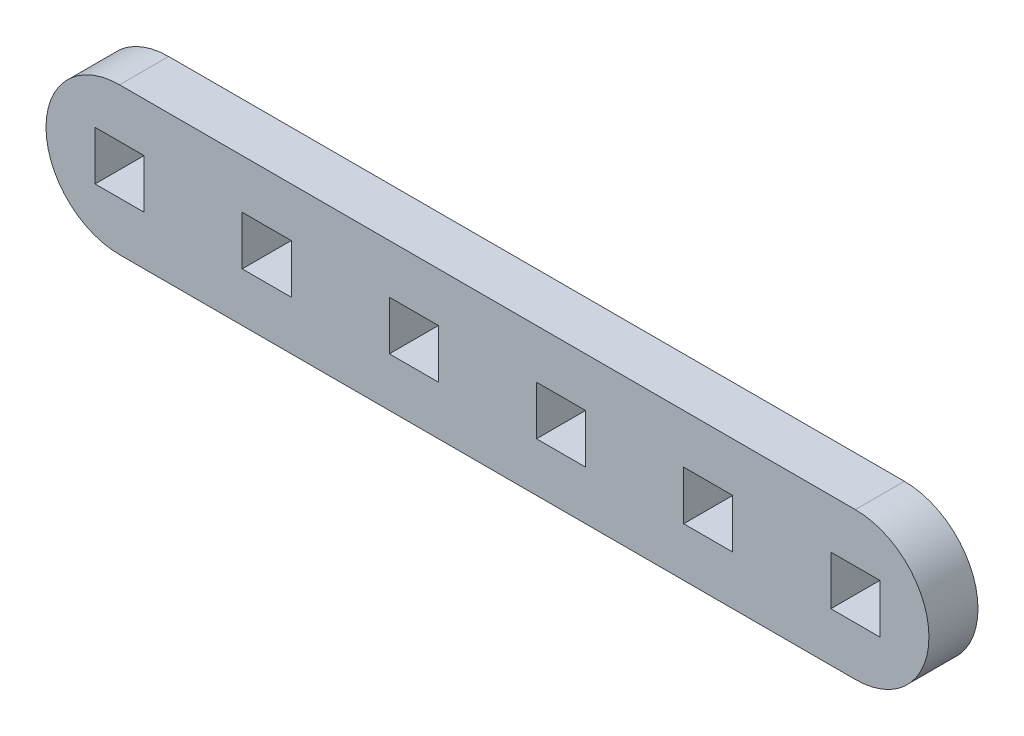
ISO-10303-21;
HEADER;
FILE_DESCRIPTION(('STEP AP214'),'2;1');
FILE_NAME('part.step','',(''),(''),'','','');
FILE_SCHEMA(('AUTOMOTIVE_DESIGN { 1 0 10303 214 1 1 1 1 }'));
ENDSEC;
DATA;
#1=APPLICATION_CONTEXT('core data for automotive mechanical design processes');
#2=APPLICATION_PROTOCOL_DEFINITION('international standard','automotive_design',2000,#1);
#3=PRODUCT_CONTEXT('',#1,'mechanical');
#4=PRODUCT('Part','Part','',(#3));
#5=PRODUCT_RELATED_PRODUCT_CATEGORY('part','',(#4));
#6=PRODUCT_DEFINITION_FORMATION('','',#4);
#7=PRODUCT_DEFINITION_CONTEXT('part definition',#1,'design');
#8=PRODUCT_DEFINITION('design','',#6,#7);
#9=PRODUCT_DEFINITION_SHAPE('','',#8);
#10=(LENGTH_UNIT() NAMED_UNIT(*) SI_UNIT(.MILLI.,.METRE.));
#11=(NAMED_UNIT(*) PLANE_ANGLE_UNIT() SI_UNIT($,.RADIAN.));
#12=(NAMED_UNIT(*) SI_UNIT($,.STERADIAN.) SOLID_ANGLE_UNIT());
#13=UNCERTAINTY_MEASURE_WITH_UNIT(LENGTH_MEASURE(1.E-05),#10,'distance_accuracy_value','');
#14=(GEOMETRIC_REPRESENTATION_CONTEXT(3) GLOBAL_UNCERTAINTY_ASSIGNED_CONTEXT((#13)) GLOBAL_UNIT_ASSIGNED_CONTEXT((#10,
#11,#12)) REPRESENTATION_CONTEXT('',''));
#15=CARTESIAN_POINT('',(0.,0.,0.));
#16=DIRECTION('',(0.,0.,1.));
#17=DIRECTION('',(1.,0.,0.));
#18=AXIS2_PLACEMENT_3D('',#15,#16,#17);
#19=CARTESIAN_POINT('',(12.1812224812,293.6364750946,3.));
#20=DIRECTION('',(0.,0.,1.));
#21=DIRECTION('',(1.,0.,0.));
#22=AXIS2_PLACEMENT_3D('',#19,#20,#21);
#23=PLANE('',#22);
#24=DIRECTION('',(0.,-1.,0.));
#25=VECTOR('',#24,1.);
#26=CARTESIAN_POINT('',(55.6812224812,295.1364750946,3.));
#27=LINE('',#26,#25);
#28=CARTESIAN_POINT('',(55.6812224812,295.1364750946,3.));
#29=VERTEX_POINT('',#28);
#30=CARTESIAN_POINT('',(55.6812224812,292.1364750946,3.));
#31=VERTEX_POINT('',#30);
#32=EDGE_CURVE('E256',#29,#31,#27,.T.);
#33=ORIENTED_EDGE('',*,*,#32,.F.);
#34=DIRECTION('',(-1.,0.,0.));
#35=VECTOR('',#34,1.);
#36=CARTESIAN_POINT('',(58.6812224812,295.1364750946,3.));
#37=LINE('',#36,#35);
#38=CARTESIAN_POINT('',(58.6812224812,295.1364750946,3.));
#39=VERTEX_POINT('',#38);
#40=EDGE_CURVE('E254',#39,#29,#37,.T.);
#41=ORIENTED_EDGE('',*,*,#40,.F.);
#42=DIRECTION('',(0.,1.,0.));
#43=VECTOR('',#42,1.);
#44=CARTESIAN_POINT('',(58.6812224812,292.1364750946,3.));
#45=LINE('',#44,#43);
#46=CARTESIAN_POINT('',(58.6812224812,292.1364750946,3.));
#47=VERTEX_POINT('',#46);
#48=EDGE_CURVE('E262',#47,#39,#45,.T.);
#49=ORIENTED_EDGE('',*,*,#48,.F.);
#50=DIRECTION('',(1.,0.,0.));
#51=VECTOR('',#50,1.);
#52=CARTESIAN_POINT('',(55.6812224812,292.1364750946,3.));
#53=LINE('',#52,#51);
#54=EDGE_CURVE('E259',#31,#47,#53,.T.);
#55=ORIENTED_EDGE('',*,*,#54,.F.);
#56=EDGE_LOOP('',(#33,#41,#49,#55));
#57=FACE_BOUND('',#56,.T.);
#58=DIRECTION('',(0.,-1.,0.));
#59=VECTOR('',#58,1.);
#60=CARTESIAN_POINT('',(28.6812224812,295.1364750946,3.));
#61=LINE('',#60,#59);
#62=CARTESIAN_POINT('',(28.6812224812,295.1364750946,3.));
#63=VERTEX_POINT('',#62);
#64=CARTESIAN_POINT('',(28.6812224812,292.1364750946,3.));
#65=VERTEX_POINT('',#64);
#66=EDGE_CURVE('E318',#63,#65,#61,.T.);
#67=ORIENTED_EDGE('',*,*,#66,.F.);
#68=DIRECTION('',(-1.,0.,0.));
#69=VECTOR('',#68,1.);
#70=CARTESIAN_POINT('',(31.6812224812,295.1364750946,3.));
#71=LINE('',#70,#69);
#72=CARTESIAN_POINT('',(31.6812224812,295.1364750946,3.));
#73=VERTEX_POINT('',#72);
#74=EDGE_CURVE('E316',#73,#63,#71,.T.);
#75=ORIENTED_EDGE('',*,*,#74,.F.);
#76=DIRECTION('',(0.,1.,0.));
#77=VECTOR('',#76,1.);
#78=CARTESIAN_POINT('',(31.6812224812,292.1364750946,3.));
#79=LINE('',#78,#77);
#80=CARTESIAN_POINT('',(31.6812224812,292.1364750946,3.));
#81=VERTEX_POINT('',#80);
#82=EDGE_CURVE('E324',#81,#73,#79,.T.);
#83=ORIENTED_EDGE('',*,*,#82,.F.);
#84=DIRECTION('',(1.,0.,0.));
#85=VECTOR('',#84,1.);
#86=CARTESIAN_POINT('',(28.6812224812,292.1364750946,3.));
#87=LINE('',#86,#85);
#88=EDGE_CURVE('E321',#65,#81,#87,.T.);
#89=ORIENTED_EDGE('',*,*,#88,.F.);
#90=EDGE_LOOP('',(#67,#75,#83,#89));
#91=FACE_BOUND('',#90,.T.);
#92=DIRECTION('',(0.,-1.,0.));
#93=VECTOR('',#92,1.);
#94=CARTESIAN_POINT('',(10.6812224812,295.1364750946,3.));
#95=LINE('',#94,#93);
#96=CARTESIAN_POINT('',(10.6812224812,295.1364750946,3.));
#97=VERTEX_POINT('',#96);
#98=CARTESIAN_POINT('',(10.6812224812,292.1364750946,3.));
#99=VERTEX_POINT('',#98);
#100=EDGE_CURVE('E380',#97,#99,#95,.T.);
#101=ORIENTED_EDGE('',*,*,#100,.F.);
#102=DIRECTION('',(-1.,0.,0.));
#103=VECTOR('',#102,1.);
#104=CARTESIAN_POINT('',(13.6812224812,295.1364750946,3.));
#105=LINE('',#104,#103);
#106=CARTESIAN_POINT('',(13.6812224812,295.1364750946,3.));
#107=VERTEX_POINT('',#106);
#108=EDGE_CURVE('E378',#107,#97,#105,.T.);
#109=ORIENTED_EDGE('',*,*,#108,.F.);
#110=DIRECTION('',(0.,1.,0.));
#111=VECTOR('',#110,1.);
#112=CARTESIAN_POINT('',(13.6812224812,292.1364750946,3.));
#113=LINE('',#112,#111);
#114=CARTESIAN_POINT('',(13.6812224812,292.1364750946,3.));
#115=VERTEX_POINT('',#114);
#116=EDGE_CURVE('E386',#115,#107,#113,.T.);
#117=ORIENTED_EDGE('',*,*,#116,.F.);
#118=DIRECTION('',(1.,0.,0.));
#119=VECTOR('',#118,1.);
#120=CARTESIAN_POINT('',(10.6812224812,292.1364750946,3.));
#121=LINE('',#120,#119);
#122=EDGE_CURVE('E383',#99,#115,#121,.T.);
#123=ORIENTED_EDGE('',*,*,#122,.F.);
#124=EDGE_LOOP('',(#101,#109,#117,#123));
#125=FACE_BOUND('',#124,.T.);
#126=CARTESIAN_POINT('',(12.1812224812,293.6364750946,3.));
#127=DIRECTION('',(0.,0.,1.));
#128=DIRECTION('',(1.,0.,0.));
#129=AXIS2_PLACEMENT_3D('',#126,#127,#128);
#130=CIRCLE('',#129,4.5);
#131=CARTESIAN_POINT('',(12.1812224812,298.1364750946,3.));
#132=VERTEX_POINT('',#131);
#133=CARTESIAN_POINT('',(12.1812224812,289.1364750946,3.));
#134=VERTEX_POINT('',#133);
#135=EDGE_CURVE('E409',#132,#134,#130,.T.);
#136=ORIENTED_EDGE('',*,*,#135,.T.);
#137=DIRECTION('',(1.,0.,0.));
#138=VECTOR('',#137,1.);
#139=CARTESIAN_POINT('',(12.1812224812,289.1364750946,3.));
#140=LINE('',#139,#138);
#141=CARTESIAN_POINT('',(57.1812224812,289.1364750946,3.));
#142=VERTEX_POINT('',#141);
#143=EDGE_CURVE('E412',#134,#142,#140,.T.);
#144=ORIENTED_EDGE('',*,*,#143,.T.);
#145=CARTESIAN_POINT('',(57.1812224812,293.6364750946,3.));
#146=DIRECTION('',(0.,0.,1.));
#147=DIRECTION('',(1.,0.,0.));
#148=AXIS2_PLACEMENT_3D('',#145,#146,#147);
#149=CIRCLE('',#148,4.5);
#150=CARTESIAN_POINT('',(57.1812224812,298.1364750946,3.));
#151=VERTEX_POINT('',#150);
#152=EDGE_CURVE('E415',#142,#151,#149,.T.);
#153=ORIENTED_EDGE('',*,*,#152,.T.);
#154=DIRECTION('',(-1.,0.,0.));
#155=VECTOR('',#154,1.);
#156=CARTESIAN_POINT('',(12.1812224812,298.1364750946,3.));
#157=LINE('',#156,#155);
#158=EDGE_CURVE('E417',#151,#132,#157,.T.);
#159=ORIENTED_EDGE('',*,*,#158,.T.);
#160=EDGE_LOOP('',(#136,#144,#153,#159));
#161=FACE_BOUND('',#160,.T.);
#162=DIRECTION('',(0.,-1.,0.));
#163=VECTOR('',#162,1.);
#164=CARTESIAN_POINT('',(19.6812224812,295.1364750946,3.));
#165=LINE('',#164,#163);
#166=CARTESIAN_POINT('',(19.6812224812,295.1364750946,3.));
#167=VERTEX_POINT('',#166);
#168=CARTESIAN_POINT('',(19.6812224812,292.1364750946,3.));
#169=VERTEX_POINT('',#168);
#170=EDGE_CURVE('E349',#167,#169,#165,.T.);
#171=ORIENTED_EDGE('',*,*,#170,.F.);
#172=DIRECTION('',(-1.,0.,0.));
#173=VECTOR('',#172,1.);
#174=CARTESIAN_POINT('',(22.6812224812,295.1364750946,3.));
#175=LINE('',#174,#173);
#176=CARTESIAN_POINT('',(22.6812224812,295.1364750946,3.));
#177=VERTEX_POINT('',#176);
#178=EDGE_CURVE('E347',#177,#167,#175,.T.);
#179=ORIENTED_EDGE('',*,*,#178,.F.);
#180=DIRECTION('',(0.,1.,0.));
#181=VECTOR('',#180,1.);
#182=CARTESIAN_POINT('',(22.6812224812,292.1364750946,3.));
#183=LINE('',#182,#181);
#184=CARTESIAN_POINT('',(22.6812224812,292.1364750946,3.));
#185=VERTEX_POINT('',#184);
#186=EDGE_CURVE('E355',#185,#177,#183,.T.);
#187=ORIENTED_EDGE('',*,*,#186,.F.);
#188=DIRECTION('',(1.,0.,0.));
#189=VECTOR('',#188,1.);
#190=CARTESIAN_POINT('',(19.6812224812,292.1364750946,3.));
#191=LINE('',#190,#189);
#192=EDGE_CURVE('E352',#169,#185,#191,.T.);
#193=ORIENTED_EDGE('',*,*,#192,.F.);
#194=EDGE_LOOP('',(#171,#179,#187,#193));
#195=FACE_BOUND('',#194,.T.);
#196=DIRECTION('',(0.,-1.,0.));
#197=VECTOR('',#196,1.);
#198=CARTESIAN_POINT('',(37.6812224812,295.1364750946,3.));
#199=LINE('',#198,#197);
#200=CARTESIAN_POINT('',(37.6812224812,295.1364750946,3.));
#201=VERTEX_POINT('',#200);
#202=CARTESIAN_POINT('',(37.6812224812,292.1364750946,3.));
#203=VERTEX_POINT('',#202);
#204=EDGE_CURVE('E287',#201,#203,#199,.T.);
#205=ORIENTED_EDGE('',*,*,#204,.F.);
#206=DIRECTION('',(-1.,0.,0.));
#207=VECTOR('',#206,1.);
#208=CARTESIAN_POINT('',(40.6812224812,295.1364750946,3.));
#209=LINE('',#208,#207);
#210=CARTESIAN_POINT('',(40.6812224812,295.1364750946,3.));
#211=VERTEX_POINT('',#210);
#212=EDGE_CURVE('E285',#211,#201,#209,.T.);
#213=ORIENTED_EDGE('',*,*,#212,.F.);
#214=DIRECTION('',(0.,1.,0.));
#215=VECTOR('',#214,1.);
#216=CARTESIAN_POINT('',(40.6812224812,292.1364750946,3.));
#217=LINE('',#216,#215);
#218=CARTESIAN_POINT('',(40.6812224812,292.1364750946,3.));
#219=VERTEX_POINT('',#218);
#220=EDGE_CURVE('E293',#219,#211,#217,.T.);
#221=ORIENTED_EDGE('',*,*,#220,.F.);
#222=DIRECTION('',(1.,0.,0.));
#223=VECTOR('',#222,1.);
#224=CARTESIAN_POINT('',(37.6812224812,292.1364750946,3.));
#225=LINE('',#224,#223);
#226=EDGE_CURVE('E290',#203,#219,#225,.T.);
#227=ORIENTED_EDGE('',*,*,#226,.F.);
#228=EDGE_LOOP('',(#205,#213,#221,#227));
#229=FACE_BOUND('',#228,.T.);
#230=DIRECTION('',(0.,-1.,0.));
#231=VECTOR('',#230,1.);
#232=CARTESIAN_POINT('',(46.6812224812,295.1364750946,3.));
#233=LINE('',#232,#231);
#234=CARTESIAN_POINT('',(46.6812224812,295.1364750946,3.));
#235=VERTEX_POINT('',#234);
#236=CARTESIAN_POINT('',(46.6812224812,292.1364750946,3.));
#237=VERTEX_POINT('',#236);
#238=EDGE_CURVE('E226',#235,#237,#233,.T.);
#239=ORIENTED_EDGE('',*,*,#238,.F.);
#240=DIRECTION('',(-1.,0.,0.));
#241=VECTOR('',#240,1.);
#242=CARTESIAN_POINT('',(49.6812224812,295.1364750946,3.));
#243=LINE('',#242,#241);
#244=CARTESIAN_POINT('',(49.6812224812,295.1364750946,3.));
#245=VERTEX_POINT('',#244);
#246=EDGE_CURVE('E218',#245,#235,#243,.T.);
#247=ORIENTED_EDGE('',*,*,#246,.F.);
#248=DIRECTION('',(0.,1.,0.));
#249=VECTOR('',#248,1.);
#250=CARTESIAN_POINT('',(49.6812224812,292.1364750946,3.));
#251=LINE('',#250,#249);
#252=CARTESIAN_POINT('',(49.6812224812,292.1364750946,3.));
#253=VERTEX_POINT('',#252);
#254=EDGE_CURVE('E240',#253,#245,#251,.T.);
#255=ORIENTED_EDGE('',*,*,#254,.F.);
#256=DIRECTION('',(1.,0.,0.));
#257=VECTOR('',#256,1.);
#258=CARTESIAN_POINT('',(46.6812224812,292.1364750946,3.));
#259=LINE('',#258,#257);
#260=EDGE_CURVE('E238',#237,#253,#259,.T.);
#261=ORIENTED_EDGE('',*,*,#260,.F.);
#262=EDGE_LOOP('',(#239,#247,#255,#261));
#263=FACE_BOUND('',#262,.T.);
#264=ADVANCED_FACE('F33',(#57,#91,#125,#161,#195,#229,#263),#23,.T.);
#265=CARTESIAN_POINT('',(12.1812224812,293.6364750946,0.));
#266=DIRECTION('',(0.,0.,1.));
#267=DIRECTION('',(1.,0.,0.));
#268=AXIS2_PLACEMENT_3D('',#265,#266,#267);
#269=PLANE('',#268);
#270=DIRECTION('',(-1.,0.,0.));
#271=VECTOR('',#270,1.);
#272=CARTESIAN_POINT('',(58.6812224812,295.1364750946,0.));
#273=LINE('',#272,#271);
#274=CARTESIAN_POINT('',(58.6812224812,295.1364750946,0.));
#275=VERTEX_POINT('',#274);
#276=CARTESIAN_POINT('',(55.6812224812,295.1364750946,0.));
#277=VERTEX_POINT('',#276);
#278=EDGE_CURVE('E234',#275,#277,#273,.T.);
#279=ORIENTED_EDGE('',*,*,#278,.T.);
#280=DIRECTION('',(0.,-1.,0.));
#281=VECTOR('',#280,1.);
#282=CARTESIAN_POINT('',(55.6812224812,295.1364750946,0.));
#283=LINE('',#282,#281);
#284=CARTESIAN_POINT('',(55.6812224812,292.1364750946,0.));
#285=VERTEX_POINT('',#284);
#286=EDGE_CURVE('E267',#277,#285,#283,.T.);
#287=ORIENTED_EDGE('',*,*,#286,.T.);
#288=DIRECTION('',(1.,0.,0.));
#289=VECTOR('',#288,1.);
#290=CARTESIAN_POINT('',(55.6812224812,292.1364750946,0.));
#291=LINE('',#290,#289);
#292=CARTESIAN_POINT('',(58.6812224812,292.1364750946,0.));
#293=VERTEX_POINT('',#292);
#294=EDGE_CURVE('E270',#285,#293,#291,.T.);
#295=ORIENTED_EDGE('',*,*,#294,.T.);
#296=DIRECTION('',(0.,1.,0.));
#297=VECTOR('',#296,1.);
#298=CARTESIAN_POINT('',(58.6812224812,292.1364750946,0.));
#299=LINE('',#298,#297);
#300=EDGE_CURVE('E257',#293,#275,#299,.T.);
#301=ORIENTED_EDGE('',*,*,#300,.T.);
#302=EDGE_LOOP('',(#279,#287,#295,#301));
#303=FACE_BOUND('',#302,.T.);
#304=DIRECTION('',(-1.,0.,0.));
#305=VECTOR('',#304,1.);
#306=CARTESIAN_POINT('',(31.6812224812,295.1364750946,0.));
#307=LINE('',#306,#305);
#308=CARTESIAN_POINT('',(31.6812224812,295.1364750946,0.));
#309=VERTEX_POINT('',#308);
#310=CARTESIAN_POINT('',(28.6812224812,295.1364750946,0.));
#311=VERTEX_POINT('',#310);
#312=EDGE_CURVE('E315',#309,#311,#307,.T.);
#313=ORIENTED_EDGE('',*,*,#312,.T.);
#314=DIRECTION('',(0.,-1.,0.));
#315=VECTOR('',#314,1.);
#316=CARTESIAN_POINT('',(28.6812224812,295.1364750946,0.));
#317=LINE('',#316,#315);
#318=CARTESIAN_POINT('',(28.6812224812,292.1364750946,0.));
#319=VERTEX_POINT('',#318);
#320=EDGE_CURVE('E329',#311,#319,#317,.T.);
#321=ORIENTED_EDGE('',*,*,#320,.T.);
#322=DIRECTION('',(1.,0.,0.));
#323=VECTOR('',#322,1.);
#324=CARTESIAN_POINT('',(28.6812224812,292.1364750946,0.));
#325=LINE('',#324,#323);
#326=CARTESIAN_POINT('',(31.6812224812,292.1364750946,0.));
#327=VERTEX_POINT('',#326);
#328=EDGE_CURVE('E332',#319,#327,#325,.T.);
#329=ORIENTED_EDGE('',*,*,#328,.T.);
#330=DIRECTION('',(0.,1.,0.));
#331=VECTOR('',#330,1.);
#332=CARTESIAN_POINT('',(31.6812224812,292.1364750946,0.));
#333=LINE('',#332,#331);
#334=EDGE_CURVE('E319',#327,#309,#333,.T.);
#335=ORIENTED_EDGE('',*,*,#334,.T.);
#336=EDGE_LOOP('',(#313,#321,#329,#335));
#337=FACE_BOUND('',#336,.T.);
#338=DIRECTION('',(-1.,0.,0.));
#339=VECTOR('',#338,1.);
#340=CARTESIAN_POINT('',(13.6812224812,295.1364750946,0.));
#341=LINE('',#340,#339);
#342=CARTESIAN_POINT('',(13.6812224812,295.1364750946,0.));
#343=VERTEX_POINT('',#342);
#344=CARTESIAN_POINT('',(10.6812224812,295.1364750946,0.));
#345=VERTEX_POINT('',#344);
#346=EDGE_CURVE('E377',#343,#345,#341,.T.);
#347=ORIENTED_EDGE('',*,*,#346,.T.);
#348=DIRECTION('',(0.,-1.,0.));
#349=VECTOR('',#348,1.);
#350=CARTESIAN_POINT('',(10.6812224812,295.1364750946,0.));
#351=LINE('',#350,#349);
#352=CARTESIAN_POINT('',(10.6812224812,292.1364750946,0.));
#353=VERTEX_POINT('',#352);
#354=EDGE_CURVE('E391',#345,#353,#351,.T.);
#355=ORIENTED_EDGE('',*,*,#354,.T.);
#356=DIRECTION('',(1.,0.,0.));
#357=VECTOR('',#356,1.);
#358=CARTESIAN_POINT('',(10.6812224812,292.1364750946,0.));
#359=LINE('',#358,#357);
#360=CARTESIAN_POINT('',(13.6812224812,292.1364750946,0.));
#361=VERTEX_POINT('',#360);
#362=EDGE_CURVE('E394',#353,#361,#359,.T.);
#363=ORIENTED_EDGE('',*,*,#362,.T.);
#364=DIRECTION('',(0.,1.,0.));
#365=VECTOR('',#364,1.);
#366=CARTESIAN_POINT('',(13.6812224812,292.1364750946,0.));
#367=LINE('',#366,#365);
#368=EDGE_CURVE('E381',#361,#343,#367,.T.);
#369=ORIENTED_EDGE('',*,*,#368,.T.);
#370=EDGE_LOOP('',(#347,#355,#363,#369));
#371=FACE_BOUND('',#370,.T.);
#372=CARTESIAN_POINT('',(12.1812224812,293.6364750946,0.));
#373=DIRECTION('',(0.,0.,1.));
#374=DIRECTION('',(1.,0.,0.));
#375=AXIS2_PLACEMENT_3D('',#372,#373,#374);
#376=CIRCLE('',#375,4.5);
#377=CARTESIAN_POINT('',(12.1812224812,298.1364750946,0.));
#378=VERTEX_POINT('',#377);
#379=CARTESIAN_POINT('',(12.1812224812,289.1364750946,0.));
#380=VERTEX_POINT('',#379);
#381=EDGE_CURVE('E408',#378,#380,#376,.T.);
#382=ORIENTED_EDGE('',*,*,#381,.F.);
#383=DIRECTION('',(-1.,0.,0.));
#384=VECTOR('',#383,1.);
#385=CARTESIAN_POINT('',(12.1812224812,298.1364750946,0.));
#386=LINE('',#385,#384);
#387=CARTESIAN_POINT('',(57.1812224812,298.1364750946,0.));
#388=VERTEX_POINT('',#387);
#389=EDGE_CURVE('E413',#388,#378,#386,.T.);
#390=ORIENTED_EDGE('',*,*,#389,.F.);
#391=CARTESIAN_POINT('',(57.1812224812,293.6364750946,0.));
#392=DIRECTION('',(0.,0.,1.));
#393=DIRECTION('',(1.,0.,0.));
#394=AXIS2_PLACEMENT_3D('',#391,#392,#393);
#395=CIRCLE('',#394,4.5);
#396=CARTESIAN_POINT('',(57.1812224812,289.1364750946,0.));
#397=VERTEX_POINT('',#396);
#398=EDGE_CURVE('E424',#397,#388,#395,.T.);
#399=ORIENTED_EDGE('',*,*,#398,.F.);
#400=DIRECTION('',(1.,0.,0.));
#401=VECTOR('',#400,1.);
#402=CARTESIAN_POINT('',(12.1812224812,289.1364750946,0.));
#403=LINE('',#402,#401);
#404=EDGE_CURVE('E422',#380,#397,#403,.T.);
#405=ORIENTED_EDGE('',*,*,#404,.F.);
#406=EDGE_LOOP('',(#382,#390,#399,#405));
#407=FACE_BOUND('',#406,.T.);
#408=DIRECTION('',(-1.,0.,0.));
#409=VECTOR('',#408,1.);
#410=CARTESIAN_POINT('',(22.6812224812,295.1364750946,0.));
#411=LINE('',#410,#409);
#412=CARTESIAN_POINT('',(22.6812224812,295.1364750946,0.));
#413=VERTEX_POINT('',#412);
#414=CARTESIAN_POINT('',(19.6812224812,295.1364750946,0.));
#415=VERTEX_POINT('',#414);
#416=EDGE_CURVE('E346',#413,#415,#411,.T.);
#417=ORIENTED_EDGE('',*,*,#416,.T.);
#418=DIRECTION('',(0.,-1.,0.));
#419=VECTOR('',#418,1.);
#420=CARTESIAN_POINT('',(19.6812224812,295.1364750946,0.));
#421=LINE('',#420,#419);
#422=CARTESIAN_POINT('',(19.6812224812,292.1364750946,0.));
#423=VERTEX_POINT('',#422);
#424=EDGE_CURVE('E360',#415,#423,#421,.T.);
#425=ORIENTED_EDGE('',*,*,#424,.T.);
#426=DIRECTION('',(1.,0.,0.));
#427=VECTOR('',#426,1.);
#428=CARTESIAN_POINT('',(19.6812224812,292.1364750946,0.));
#429=LINE('',#428,#427);
#430=CARTESIAN_POINT('',(22.6812224812,292.1364750946,0.));
#431=VERTEX_POINT('',#430);
#432=EDGE_CURVE('E363',#423,#431,#429,.T.);
#433=ORIENTED_EDGE('',*,*,#432,.T.);
#434=DIRECTION('',(0.,1.,0.));
#435=VECTOR('',#434,1.);
#436=CARTESIAN_POINT('',(22.6812224812,292.1364750946,0.));
#437=LINE('',#436,#435);
#438=EDGE_CURVE('E350',#431,#413,#437,.T.);
#439=ORIENTED_EDGE('',*,*,#438,.T.);
#440=EDGE_LOOP('',(#417,#425,#433,#439));
#441=FACE_BOUND('',#440,.T.);
#442=DIRECTION('',(-1.,0.,0.));
#443=VECTOR('',#442,1.);
#444=CARTESIAN_POINT('',(40.6812224812,295.1364750946,0.));
#445=LINE('',#444,#443);
#446=CARTESIAN_POINT('',(40.6812224812,295.1364750946,0.));
#447=VERTEX_POINT('',#446);
#448=CARTESIAN_POINT('',(37.6812224812,295.1364750946,0.));
#449=VERTEX_POINT('',#448);
#450=EDGE_CURVE('E284',#447,#449,#445,.T.);
#451=ORIENTED_EDGE('',*,*,#450,.T.);
#452=DIRECTION('',(0.,-1.,0.));
#453=VECTOR('',#452,1.);
#454=CARTESIAN_POINT('',(37.6812224812,295.1364750946,0.));
#455=LINE('',#454,#453);
#456=CARTESIAN_POINT('',(37.6812224812,292.1364750946,0.));
#457=VERTEX_POINT('',#456);
#458=EDGE_CURVE('E298',#449,#457,#455,.T.);
#459=ORIENTED_EDGE('',*,*,#458,.T.);
#460=DIRECTION('',(1.,0.,0.));
#461=VECTOR('',#460,1.);
#462=CARTESIAN_POINT('',(37.6812224812,292.1364750946,0.));
#463=LINE('',#462,#461);
#464=CARTESIAN_POINT('',(40.6812224812,292.1364750946,0.));
#465=VERTEX_POINT('',#464);
#466=EDGE_CURVE('E301',#457,#465,#463,.T.);
#467=ORIENTED_EDGE('',*,*,#466,.T.);
#468=DIRECTION('',(0.,1.,0.));
#469=VECTOR('',#468,1.);
#470=CARTESIAN_POINT('',(40.6812224812,292.1364750946,0.));
#471=LINE('',#470,#469);
#472=EDGE_CURVE('E288',#465,#447,#471,.T.);
#473=ORIENTED_EDGE('',*,*,#472,.T.);
#474=EDGE_LOOP('',(#451,#459,#467,#473));
#475=FACE_BOUND('',#474,.T.);
#476=DIRECTION('',(-1.,0.,0.));
#477=VECTOR('',#476,1.);
#478=CARTESIAN_POINT('',(49.6812224812,295.1364750946,0.));
#479=LINE('',#478,#477);
#480=CARTESIAN_POINT('',(49.6812224812,295.1364750946,0.));
#481=VERTEX_POINT('',#480);
#482=CARTESIAN_POINT('',(46.6812224812,295.1364750946,0.));
#483=VERTEX_POINT('',#482);
#484=EDGE_CURVE('E56',#481,#483,#479,.T.);
#485=ORIENTED_EDGE('',*,*,#484,.T.);
#486=DIRECTION('',(0.,-1.,0.));
#487=VECTOR('',#486,1.);
#488=CARTESIAN_POINT('',(46.6812224812,295.1364750946,0.));
#489=LINE('',#488,#487);
#490=CARTESIAN_POINT('',(46.6812224812,292.1364750946,0.));
#491=VERTEX_POINT('',#490);
#492=EDGE_CURVE('E233',#483,#491,#489,.T.);
#493=ORIENTED_EDGE('',*,*,#492,.T.);
#494=DIRECTION('',(1.,0.,0.));
#495=VECTOR('',#494,1.);
#496=CARTESIAN_POINT('',(46.6812224812,292.1364750946,0.));
#497=LINE('',#496,#495);
#498=CARTESIAN_POINT('',(49.6812224812,292.1364750946,0.));
#499=VERTEX_POINT('',#498);
#500=EDGE_CURVE('E246',#491,#499,#497,.T.);
#501=ORIENTED_EDGE('',*,*,#500,.T.);
#502=DIRECTION('',(0.,1.,0.));
#503=VECTOR('',#502,1.);
#504=CARTESIAN_POINT('',(49.6812224812,292.1364750946,0.));
#505=LINE('',#504,#503);
#506=EDGE_CURVE('E227',#499,#481,#505,.T.);
#507=ORIENTED_EDGE('',*,*,#506,.T.);
#508=EDGE_LOOP('',(#485,#493,#501,#507));
#509=FACE_BOUND('',#508,.T.);
#510=ADVANCED_FACE('F442',(#303,#337,#371,#407,#441,#475,#509),#269,.F.);
#511=CARTESIAN_POINT('',(12.1812224812,293.6364750946,3.));
#512=DIRECTION('',(0.,0.,-1.));
#513=DIRECTION('',(-1.,0.,0.));
#514=AXIS2_PLACEMENT_3D('',#511,#512,#513);
#515=CYLINDRICAL_SURFACE('',#514,4.5);
#516=ORIENTED_EDGE('',*,*,#381,.T.);
#517=DIRECTION('',(0.,0.,-1.));
#518=VECTOR('',#517,1.);
#519=CARTESIAN_POINT('',(12.1812224812,289.1364750946,3.));
#520=LINE('',#519,#518);
#521=EDGE_CURVE('E11',#134,#380,#520,.T.);
#522=ORIENTED_EDGE('',*,*,#521,.F.);
#523=ORIENTED_EDGE('',*,*,#135,.F.);
#524=DIRECTION('',(0.,0.,-1.));
#525=VECTOR('',#524,1.);
#526=CARTESIAN_POINT('',(12.1812224812,298.1364750946,3.));
#527=LINE('',#526,#525);
#528=EDGE_CURVE('E419',#132,#378,#527,.T.);
#529=ORIENTED_EDGE('',*,*,#528,.T.);
#530=EDGE_LOOP('',(#516,#522,#523,#529));
#531=FACE_BOUND('',#530,.T.);
#532=ADVANCED_FACE('F35',(#531),#515,.T.);
#533=CARTESIAN_POINT('',(12.1812224812,289.1364750946,3.));
#534=DIRECTION('',(0.,1.,0.));
#535=DIRECTION('',(0.,0.,1.));
#536=AXIS2_PLACEMENT_3D('',#533,#534,#535);
#537=PLANE('',#536);
#538=ORIENTED_EDGE('',*,*,#404,.T.);
#539=DIRECTION('',(0.,0.,-1.));
#540=VECTOR('',#539,1.);
#541=CARTESIAN_POINT('',(57.1812224812,289.1364750946,3.));
#542=LINE('',#541,#540);
#543=EDGE_CURVE('E41',#142,#397,#542,.T.);
#544=ORIENTED_EDGE('',*,*,#543,.F.);
#545=ORIENTED_EDGE('',*,*,#143,.F.);
#546=ORIENTED_EDGE('',*,*,#521,.T.);
#547=EDGE_LOOP('',(#538,#544,#545,#546));
#548=FACE_BOUND('',#547,.T.);
#549=ADVANCED_FACE('F453',(#548),#537,.F.);
#550=CARTESIAN_POINT('',(57.1812224812,293.6364750946,3.));
#551=DIRECTION('',(0.,0.,-1.));
#552=DIRECTION('',(-1.,0.,0.));
#553=AXIS2_PLACEMENT_3D('',#550,#551,#552);
#554=CYLINDRICAL_SURFACE('',#553,4.5);
#555=ORIENTED_EDGE('',*,*,#398,.T.);
#556=DIRECTION('',(0.,0.,-1.));
#557=VECTOR('',#556,1.);
#558=CARTESIAN_POINT('',(57.1812224812,298.1364750946,3.));
#559=LINE('',#558,#557);
#560=EDGE_CURVE('E429',#151,#388,#559,.T.);
#561=ORIENTED_EDGE('',*,*,#560,.F.);
#562=ORIENTED_EDGE('',*,*,#152,.F.);
#563=ORIENTED_EDGE('',*,*,#543,.T.);
#564=EDGE_LOOP('',(#555,#561,#562,#563));
#565=FACE_BOUND('',#564,.T.);
#566=ADVANCED_FACE('F436',(#565),#554,.T.);
#567=CARTESIAN_POINT('',(12.1812224812,298.1364750946,3.));
#568=DIRECTION('',(0.,-1.,0.));
#569=DIRECTION('',(0.,0.,-1.));
#570=AXIS2_PLACEMENT_3D('',#567,#568,#569);
#571=PLANE('',#570);
#572=ORIENTED_EDGE('',*,*,#389,.T.);
#573=ORIENTED_EDGE('',*,*,#528,.F.);
#574=ORIENTED_EDGE('',*,*,#158,.F.);
#575=ORIENTED_EDGE('',*,*,#560,.T.);
#576=EDGE_LOOP('',(#572,#573,#574,#575));
#577=FACE_BOUND('',#576,.T.);
#578=ADVANCED_FACE('F446',(#577),#571,.F.);
#579=CARTESIAN_POINT('',(13.6812224812,295.1364750946,3.));
#580=DIRECTION('',(0.,-1.,0.));
#581=DIRECTION('',(0.,0.,-1.));
#582=AXIS2_PLACEMENT_3D('',#579,#580,#581);
#583=PLANE('',#582);
#584=ORIENTED_EDGE('',*,*,#346,.F.);
#585=DIRECTION('',(0.,0.,-1.));
#586=VECTOR('',#585,1.);
#587=CARTESIAN_POINT('',(13.6812224812,295.1364750946,3.));
#588=LINE('',#587,#586);
#589=EDGE_CURVE('E388',#107,#343,#588,.T.);
#590=ORIENTED_EDGE('',*,*,#589,.F.);
#591=ORIENTED_EDGE('',*,*,#108,.T.);
#592=DIRECTION('',(0.,0.,-1.));
#593=VECTOR('',#592,1.);
#594=CARTESIAN_POINT('',(10.6812224812,295.1364750946,3.));
#595=LINE('',#594,#593);
#596=EDGE_CURVE('E405',#97,#345,#595,.T.);
#597=ORIENTED_EDGE('',*,*,#596,.T.);
#598=EDGE_LOOP('',(#584,#590,#591,#597));
#599=FACE_BOUND('',#598,.T.);
#600=ADVANCED_FACE('F471',(#599),#583,.T.);
#601=CARTESIAN_POINT('',(10.6812224812,295.1364750946,3.));
#602=DIRECTION('',(1.,0.,0.));
#603=DIRECTION('',(0.,0.,-1.));
#604=AXIS2_PLACEMENT_3D('',#601,#602,#603);
#605=PLANE('',#604);
#606=ORIENTED_EDGE('',*,*,#354,.F.);
#607=ORIENTED_EDGE('',*,*,#596,.F.);
#608=ORIENTED_EDGE('',*,*,#100,.T.);
#609=DIRECTION('',(0.,0.,-1.));
#610=VECTOR('',#609,1.);
#611=CARTESIAN_POINT('',(10.6812224812,292.1364750946,3.));
#612=LINE('',#611,#610);
#613=EDGE_CURVE('E403',#99,#353,#612,.T.);
#614=ORIENTED_EDGE('',*,*,#613,.T.);
#615=EDGE_LOOP('',(#606,#607,#608,#614));
#616=FACE_BOUND('',#615,.T.);
#617=ADVANCED_FACE('F478',(#616),#605,.T.);
#618=CARTESIAN_POINT('',(10.6812224812,292.1364750946,3.));
#619=DIRECTION('',(0.,1.,0.));
#620=DIRECTION('',(0.,0.,1.));
#621=AXIS2_PLACEMENT_3D('',#618,#619,#620);
#622=PLANE('',#621);
#623=ORIENTED_EDGE('',*,*,#362,.F.);
#624=ORIENTED_EDGE('',*,*,#613,.F.);
#625=ORIENTED_EDGE('',*,*,#122,.T.);
#626=DIRECTION('',(0.,0.,-1.));
#627=VECTOR('',#626,1.);
#628=CARTESIAN_POINT('',(13.6812224812,292.1364750946,3.));
#629=LINE('',#628,#627);
#630=EDGE_CURVE('E401',#115,#361,#629,.T.);
#631=ORIENTED_EDGE('',*,*,#630,.T.);
#632=EDGE_LOOP('',(#623,#624,#625,#631));
#633=FACE_BOUND('',#632,.T.);
#634=ADVANCED_FACE('F483',(#633),#622,.T.);
#635=CARTESIAN_POINT('',(13.6812224812,292.1364750946,3.));
#636=DIRECTION('',(-1.,0.,0.));
#637=DIRECTION('',(0.,0.,1.));
#638=AXIS2_PLACEMENT_3D('',#635,#636,#637);
#639=PLANE('',#638);
#640=ORIENTED_EDGE('',*,*,#368,.F.);
#641=ORIENTED_EDGE('',*,*,#630,.F.);
#642=ORIENTED_EDGE('',*,*,#116,.T.);
#643=ORIENTED_EDGE('',*,*,#589,.T.);
#644=EDGE_LOOP('',(#640,#641,#642,#643));
#645=FACE_BOUND('',#644,.T.);
#646=ADVANCED_FACE('F491',(#645),#639,.T.);
#647=CARTESIAN_POINT('',(22.6812224812,295.1364750946,3.));
#648=DIRECTION('',(0.,-1.,0.));
#649=DIRECTION('',(0.,0.,-1.));
#650=AXIS2_PLACEMENT_3D('',#647,#648,#649);
#651=PLANE('',#650);
#652=ORIENTED_EDGE('',*,*,#416,.F.);
#653=DIRECTION('',(0.,0.,-1.));
#654=VECTOR('',#653,1.);
#655=CARTESIAN_POINT('',(22.6812224812,295.1364750946,3.));
#656=LINE('',#655,#654);
#657=EDGE_CURVE('E357',#177,#413,#656,.T.);
#658=ORIENTED_EDGE('',*,*,#657,.F.);
#659=ORIENTED_EDGE('',*,*,#178,.T.);
#660=DIRECTION('',(0.,0.,-1.));
#661=VECTOR('',#660,1.);
#662=CARTESIAN_POINT('',(19.6812224812,295.1364750946,3.));
#663=LINE('',#662,#661);
#664=EDGE_CURVE('E374',#167,#415,#663,.T.);
#665=ORIENTED_EDGE('',*,*,#664,.T.);
#666=EDGE_LOOP('',(#652,#658,#659,#665));
#667=FACE_BOUND('',#666,.T.);
#668=ADVANCED_FACE('F504',(#667),#651,.T.);
#669=CARTESIAN_POINT('',(19.6812224812,295.1364750946,3.));
#670=DIRECTION('',(1.,0.,0.));
#671=DIRECTION('',(0.,0.,-1.));
#672=AXIS2_PLACEMENT_3D('',#669,#670,#671);
#673=PLANE('',#672);
#674=ORIENTED_EDGE('',*,*,#424,.F.);
#675=ORIENTED_EDGE('',*,*,#664,.F.);
#676=ORIENTED_EDGE('',*,*,#170,.T.);
#677=DIRECTION('',(0.,0.,-1.));
#678=VECTOR('',#677,1.);
#679=CARTESIAN_POINT('',(19.6812224812,292.1364750946,3.));
#680=LINE('',#679,#678);
#681=EDGE_CURVE('E372',#169,#423,#680,.T.);
#682=ORIENTED_EDGE('',*,*,#681,.T.);
#683=EDGE_LOOP('',(#674,#675,#676,#682));
#684=FACE_BOUND('',#683,.T.);
#685=ADVANCED_FACE('F509',(#684),#673,.T.);
#686=CARTESIAN_POINT('',(19.6812224812,292.1364750946,3.));
#687=DIRECTION('',(0.,1.,0.));
#688=DIRECTION('',(0.,0.,1.));
#689=AXIS2_PLACEMENT_3D('',#686,#687,#688);
#690=PLANE('',#689);
#691=ORIENTED_EDGE('',*,*,#432,.F.);
#692=ORIENTED_EDGE('',*,*,#681,.F.);
#693=ORIENTED_EDGE('',*,*,#192,.T.);
#694=DIRECTION('',(0.,0.,-1.));
#695=VECTOR('',#694,1.);
#696=CARTESIAN_POINT('',(22.6812224812,292.1364750946,3.));
#697=LINE('',#696,#695);
#698=EDGE_CURVE('E370',#185,#431,#697,.T.);
#699=ORIENTED_EDGE('',*,*,#698,.T.);
#700=EDGE_LOOP('',(#691,#692,#693,#699));
#701=FACE_BOUND('',#700,.T.);
#702=ADVANCED_FACE('F513',(#701),#690,.T.);
#703=CARTESIAN_POINT('',(22.6812224812,292.1364750946,3.));
#704=DIRECTION('',(-1.,0.,0.));
#705=DIRECTION('',(0.,0.,1.));
#706=AXIS2_PLACEMENT_3D('',#703,#704,#705);
#707=PLANE('',#706);
#708=ORIENTED_EDGE('',*,*,#438,.F.);
#709=ORIENTED_EDGE('',*,*,#698,.F.);
#710=ORIENTED_EDGE('',*,*,#186,.T.);
#711=ORIENTED_EDGE('',*,*,#657,.T.);
#712=EDGE_LOOP('',(#708,#709,#710,#711));
#713=FACE_BOUND('',#712,.T.);
#714=ADVANCED_FACE('F517',(#713),#707,.T.);
#715=CARTESIAN_POINT('',(31.6812224812,295.1364750946,3.));
#716=DIRECTION('',(0.,-1.,0.));
#717=DIRECTION('',(0.,0.,-1.));
#718=AXIS2_PLACEMENT_3D('',#715,#716,#717);
#719=PLANE('',#718);
#720=ORIENTED_EDGE('',*,*,#312,.F.);
#721=DIRECTION('',(0.,0.,-1.));
#722=VECTOR('',#721,1.);
#723=CARTESIAN_POINT('',(31.6812224812,295.1364750946,3.));
#724=LINE('',#723,#722);
#725=EDGE_CURVE('E326',#73,#309,#724,.T.);
#726=ORIENTED_EDGE('',*,*,#725,.F.);
#727=ORIENTED_EDGE('',*,*,#74,.T.);
#728=DIRECTION('',(0.,0.,-1.));
#729=VECTOR('',#728,1.);
#730=CARTESIAN_POINT('',(28.6812224812,295.1364750946,3.));
#731=LINE('',#730,#729);
#732=EDGE_CURVE('E343',#63,#311,#731,.T.);
#733=ORIENTED_EDGE('',*,*,#732,.T.);
#734=EDGE_LOOP('',(#720,#726,#727,#733));
#735=FACE_BOUND('',#734,.T.);
#736=ADVANCED_FACE('F521',(#735),#719,.T.);
#737=CARTESIAN_POINT('',(28.6812224812,295.1364750946,3.));
#738=DIRECTION('',(1.,0.,0.));
#739=DIRECTION('',(0.,0.,-1.));
#740=AXIS2_PLACEMENT_3D('',#737,#738,#739);
#741=PLANE('',#740);
#742=ORIENTED_EDGE('',*,*,#320,.F.);
#743=ORIENTED_EDGE('',*,*,#732,.F.);
#744=ORIENTED_EDGE('',*,*,#66,.T.);
#745=DIRECTION('',(0.,0.,-1.));
#746=VECTOR('',#745,1.);
#747=CARTESIAN_POINT('',(28.6812224812,292.1364750946,3.));
#748=LINE('',#747,#746);
#749=EDGE_CURVE('E341',#65,#319,#748,.T.);
#750=ORIENTED_EDGE('',*,*,#749,.T.);
#751=EDGE_LOOP('',(#742,#743,#744,#750));
#752=FACE_BOUND('',#751,.T.);
#753=ADVANCED_FACE('F525',(#752),#741,.T.);
#754=CARTESIAN_POINT('',(28.6812224812,292.1364750946,3.));
#755=DIRECTION('',(0.,1.,0.));
#756=DIRECTION('',(0.,0.,1.));
#757=AXIS2_PLACEMENT_3D('',#754,#755,#756);
#758=PLANE('',#757);
#759=ORIENTED_EDGE('',*,*,#328,.F.);
#760=ORIENTED_EDGE('',*,*,#749,.F.);
#761=ORIENTED_EDGE('',*,*,#88,.T.);
#762=DIRECTION('',(0.,0.,-1.));
#763=VECTOR('',#762,1.);
#764=CARTESIAN_POINT('',(31.6812224812,292.1364750946,3.));
#765=LINE('',#764,#763);
#766=EDGE_CURVE('E339',#81,#327,#765,.T.);
#767=ORIENTED_EDGE('',*,*,#766,.T.);
#768=EDGE_LOOP('',(#759,#760,#761,#767));
#769=FACE_BOUND('',#768,.T.);
#770=ADVANCED_FACE('F529',(#769),#758,.T.);
#771=CARTESIAN_POINT('',(31.6812224812,292.1364750946,3.));
#772=DIRECTION('',(-1.,0.,0.));
#773=DIRECTION('',(0.,0.,1.));
#774=AXIS2_PLACEMENT_3D('',#771,#772,#773);
#775=PLANE('',#774);
#776=ORIENTED_EDGE('',*,*,#334,.F.);
#777=ORIENTED_EDGE('',*,*,#766,.F.);
#778=ORIENTED_EDGE('',*,*,#82,.T.);
#779=ORIENTED_EDGE('',*,*,#725,.T.);
#780=EDGE_LOOP('',(#776,#777,#778,#779));
#781=FACE_BOUND('',#780,.T.);
#782=ADVANCED_FACE('F533',(#781),#775,.T.);
#783=CARTESIAN_POINT('',(40.6812224812,295.1364750946,3.));
#784=DIRECTION('',(0.,-1.,0.));
#785=DIRECTION('',(0.,0.,-1.));
#786=AXIS2_PLACEMENT_3D('',#783,#784,#785);
#787=PLANE('',#786);
#788=ORIENTED_EDGE('',*,*,#450,.F.);
#789=DIRECTION('',(0.,0.,-1.));
#790=VECTOR('',#789,1.);
#791=CARTESIAN_POINT('',(40.6812224812,295.1364750946,3.));
#792=LINE('',#791,#790);
#793=EDGE_CURVE('E295',#211,#447,#792,.T.);
#794=ORIENTED_EDGE('',*,*,#793,.F.);
#795=ORIENTED_EDGE('',*,*,#212,.T.);
#796=DIRECTION('',(0.,0.,-1.));
#797=VECTOR('',#796,1.);
#798=CARTESIAN_POINT('',(37.6812224812,295.1364750946,3.));
#799=LINE('',#798,#797);
#800=EDGE_CURVE('E312',#201,#449,#799,.T.);
#801=ORIENTED_EDGE('',*,*,#800,.T.);
#802=EDGE_LOOP('',(#788,#794,#795,#801));
#803=FACE_BOUND('',#802,.T.);
#804=ADVANCED_FACE('F537',(#803),#787,.T.);
#805=CARTESIAN_POINT('',(37.6812224812,295.1364750946,3.));
#806=DIRECTION('',(1.,0.,0.));
#807=DIRECTION('',(0.,0.,-1.));
#808=AXIS2_PLACEMENT_3D('',#805,#806,#807);
#809=PLANE('',#808);
#810=ORIENTED_EDGE('',*,*,#458,.F.);
#811=ORIENTED_EDGE('',*,*,#800,.F.);
#812=ORIENTED_EDGE('',*,*,#204,.T.);
#813=DIRECTION('',(0.,0.,-1.));
#814=VECTOR('',#813,1.);
#815=CARTESIAN_POINT('',(37.6812224812,292.1364750946,3.));
#816=LINE('',#815,#814);
#817=EDGE_CURVE('E310',#203,#457,#816,.T.);
#818=ORIENTED_EDGE('',*,*,#817,.T.);
#819=EDGE_LOOP('',(#810,#811,#812,#818));
#820=FACE_BOUND('',#819,.T.);
#821=ADVANCED_FACE('F541',(#820),#809,.T.);
#822=CARTESIAN_POINT('',(37.6812224812,292.1364750946,3.));
#823=DIRECTION('',(0.,1.,0.));
#824=DIRECTION('',(0.,0.,1.));
#825=AXIS2_PLACEMENT_3D('',#822,#823,#824);
#826=PLANE('',#825);
#827=ORIENTED_EDGE('',*,*,#466,.F.);
#828=ORIENTED_EDGE('',*,*,#817,.F.);
#829=ORIENTED_EDGE('',*,*,#226,.T.);
#830=DIRECTION('',(0.,0.,-1.));
#831=VECTOR('',#830,1.);
#832=CARTESIAN_POINT('',(40.6812224812,292.1364750946,3.));
#833=LINE('',#832,#831);
#834=EDGE_CURVE('E308',#219,#465,#833,.T.);
#835=ORIENTED_EDGE('',*,*,#834,.T.);
#836=EDGE_LOOP('',(#827,#828,#829,#835));
#837=FACE_BOUND('',#836,.T.);
#838=ADVANCED_FACE('F545',(#837),#826,.T.);
#839=CARTESIAN_POINT('',(40.6812224812,292.1364750946,3.));
#840=DIRECTION('',(-1.,0.,0.));
#841=DIRECTION('',(0.,0.,1.));
#842=AXIS2_PLACEMENT_3D('',#839,#840,#841);
#843=PLANE('',#842);
#844=ORIENTED_EDGE('',*,*,#472,.F.);
#845=ORIENTED_EDGE('',*,*,#834,.F.);
#846=ORIENTED_EDGE('',*,*,#220,.T.);
#847=ORIENTED_EDGE('',*,*,#793,.T.);
#848=EDGE_LOOP('',(#844,#845,#846,#847));
#849=FACE_BOUND('',#848,.T.);
#850=ADVANCED_FACE('F549',(#849),#843,.T.);
#851=CARTESIAN_POINT('',(58.6812224812,295.1364750946,3.));
#852=DIRECTION('',(0.,-1.,0.));
#853=DIRECTION('',(0.,0.,-1.));
#854=AXIS2_PLACEMENT_3D('',#851,#852,#853);
#855=PLANE('',#854);
#856=ORIENTED_EDGE('',*,*,#278,.F.);
#857=DIRECTION('',(0.,0.,-1.));
#858=VECTOR('',#857,1.);
#859=CARTESIAN_POINT('',(58.6812224812,295.1364750946,3.));
#860=LINE('',#859,#858);
#861=EDGE_CURVE('E264',#39,#275,#860,.T.);
#862=ORIENTED_EDGE('',*,*,#861,.F.);
#863=ORIENTED_EDGE('',*,*,#40,.T.);
#864=DIRECTION('',(0.,0.,-1.));
#865=VECTOR('',#864,1.);
#866=CARTESIAN_POINT('',(55.6812224812,295.1364750946,3.));
#867=LINE('',#866,#865);
#868=EDGE_CURVE('E281',#29,#277,#867,.T.);
#869=ORIENTED_EDGE('',*,*,#868,.T.);
#870=EDGE_LOOP('',(#856,#862,#863,#869));
#871=FACE_BOUND('',#870,.T.);
#872=ADVANCED_FACE('F553',(#871),#855,.T.);
#873=CARTESIAN_POINT('',(55.6812224812,295.1364750946,3.));
#874=DIRECTION('',(1.,0.,0.));
#875=DIRECTION('',(0.,0.,-1.));
#876=AXIS2_PLACEMENT_3D('',#873,#874,#875);
#877=PLANE('',#876);
#878=ORIENTED_EDGE('',*,*,#286,.F.);
#879=ORIENTED_EDGE('',*,*,#868,.F.);
#880=ORIENTED_EDGE('',*,*,#32,.T.);
#881=DIRECTION('',(0.,0.,-1.));
#882=VECTOR('',#881,1.);
#883=CARTESIAN_POINT('',(55.6812224812,292.1364750946,3.));
#884=LINE('',#883,#882);
#885=EDGE_CURVE('E279',#31,#285,#884,.T.);
#886=ORIENTED_EDGE('',*,*,#885,.T.);
#887=EDGE_LOOP('',(#878,#879,#880,#886));
#888=FACE_BOUND('',#887,.T.);
#889=ADVANCED_FACE('F557',(#888),#877,.T.);
#890=CARTESIAN_POINT('',(55.6812224812,292.1364750946,3.));
#891=DIRECTION('',(0.,1.,0.));
#892=DIRECTION('',(0.,0.,1.));
#893=AXIS2_PLACEMENT_3D('',#890,#891,#892);
#894=PLANE('',#893);
#895=ORIENTED_EDGE('',*,*,#294,.F.);
#896=ORIENTED_EDGE('',*,*,#885,.F.);
#897=ORIENTED_EDGE('',*,*,#54,.T.);
#898=DIRECTION('',(0.,0.,-1.));
#899=VECTOR('',#898,1.);
#900=CARTESIAN_POINT('',(58.6812224812,292.1364750946,3.));
#901=LINE('',#900,#899);
#902=EDGE_CURVE('E277',#47,#293,#901,.T.);
#903=ORIENTED_EDGE('',*,*,#902,.T.);
#904=EDGE_LOOP('',(#895,#896,#897,#903));
#905=FACE_BOUND('',#904,.T.);
#906=ADVANCED_FACE('F561',(#905),#894,.T.);
#907=CARTESIAN_POINT('',(58.6812224812,292.1364750946,3.));
#908=DIRECTION('',(-1.,0.,0.));
#909=DIRECTION('',(0.,0.,1.));
#910=AXIS2_PLACEMENT_3D('',#907,#908,#909);
#911=PLANE('',#910);
#912=ORIENTED_EDGE('',*,*,#300,.F.);
#913=ORIENTED_EDGE('',*,*,#902,.F.);
#914=ORIENTED_EDGE('',*,*,#48,.T.);
#915=ORIENTED_EDGE('',*,*,#861,.T.);
#916=EDGE_LOOP('',(#912,#913,#914,#915));
#917=FACE_BOUND('',#916,.T.);
#918=ADVANCED_FACE('F565',(#917),#911,.T.);
#919=CARTESIAN_POINT('',(49.6812224812,295.1364750946,3.));
#920=DIRECTION('',(0.,-1.,0.));
#921=DIRECTION('',(0.,0.,-1.));
#922=AXIS2_PLACEMENT_3D('',#919,#920,#921);
#923=PLANE('',#922);
#924=ORIENTED_EDGE('',*,*,#484,.F.);
#925=DIRECTION('',(0.,0.,-1.));
#926=VECTOR('',#925,1.);
#927=CARTESIAN_POINT('',(49.6812224812,295.1364750946,3.));
#928=LINE('',#927,#926);
#929=EDGE_CURVE('E222',#245,#481,#928,.T.);
#930=ORIENTED_EDGE('',*,*,#929,.F.);
#931=ORIENTED_EDGE('',*,*,#246,.T.);
#932=DIRECTION('',(0.,0.,-1.));
#933=VECTOR('',#932,1.);
#934=CARTESIAN_POINT('',(46.6812224812,295.1364750946,3.));
#935=LINE('',#934,#933);
#936=EDGE_CURVE('E221',#235,#483,#935,.T.);
#937=ORIENTED_EDGE('',*,*,#936,.T.);
#938=EDGE_LOOP('',(#924,#930,#931,#937));
#939=FACE_BOUND('',#938,.T.);
#940=ADVANCED_FACE('F220',(#939),#923,.T.);
#941=CARTESIAN_POINT('',(46.6812224812,295.1364750946,3.));
#942=DIRECTION('',(1.,0.,0.));
#943=DIRECTION('',(0.,0.,-1.));
#944=AXIS2_PLACEMENT_3D('',#941,#942,#943);
#945=PLANE('',#944);
#946=ORIENTED_EDGE('',*,*,#492,.F.);
#947=ORIENTED_EDGE('',*,*,#936,.F.);
#948=ORIENTED_EDGE('',*,*,#238,.T.);
#949=DIRECTION('',(0.,0.,-1.));
#950=VECTOR('',#949,1.);
#951=CARTESIAN_POINT('',(46.6812224812,292.1364750946,3.));
#952=LINE('',#951,#950);
#953=EDGE_CURVE('E235',#237,#491,#952,.T.);
#954=ORIENTED_EDGE('',*,*,#953,.T.);
#955=EDGE_LOOP('',(#946,#947,#948,#954));
#956=FACE_BOUND('',#955,.T.);
#957=ADVANCED_FACE('F230',(#956),#945,.T.);
#958=CARTESIAN_POINT('',(46.6812224812,292.1364750946,3.));
#959=DIRECTION('',(0.,1.,0.));
#960=DIRECTION('',(0.,0.,1.));
#961=AXIS2_PLACEMENT_3D('',#958,#959,#960);
#962=PLANE('',#961);
#963=ORIENTED_EDGE('',*,*,#500,.F.);
#964=ORIENTED_EDGE('',*,*,#953,.F.);
#965=ORIENTED_EDGE('',*,*,#260,.T.);
#966=DIRECTION('',(0.,0.,-1.));
#967=VECTOR('',#966,1.);
#968=CARTESIAN_POINT('',(49.6812224812,292.1364750946,3.));
#969=LINE('',#968,#967);
#970=EDGE_CURVE('E48',#253,#499,#969,.T.);
#971=ORIENTED_EDGE('',*,*,#970,.T.);
#972=EDGE_LOOP('',(#963,#964,#965,#971));
#973=FACE_BOUND('',#972,.T.);
#974=ADVANCED_FACE('F574',(#973),#962,.T.);
#975=CARTESIAN_POINT('',(49.6812224812,292.1364750946,3.));
#976=DIRECTION('',(-1.,0.,0.));
#977=DIRECTION('',(0.,0.,1.));
#978=AXIS2_PLACEMENT_3D('',#975,#976,#977);
#979=PLANE('',#978);
#980=ORIENTED_EDGE('',*,*,#506,.F.);
#981=ORIENTED_EDGE('',*,*,#970,.F.);
#982=ORIENTED_EDGE('',*,*,#254,.T.);
#983=ORIENTED_EDGE('',*,*,#929,.T.);
#984=EDGE_LOOP('',(#980,#981,#982,#983));
#985=FACE_BOUND('',#984,.T.);
#986=ADVANCED_FACE('F577',(#985),#979,.T.);
#987=CLOSED_SHELL('',(#264,#510,#532,#549,#566,#578,#600,#617,#634,#646,#668,#685,#702,#714,
#736,#753,#770,#782,#804,#821,#838,#850,#872,#889,#906,#918,#940,#957,#974,#986));
#988=MANIFOLD_SOLID_BREP('B2',#987);
#989=ADVANCED_BREP_SHAPE_REPRESENTATION('',(#18,#988),#14);
#990=SHAPE_DEFINITION_REPRESENTATION(#9,#989);
ENDSEC;
END-ISO-10303-21;
